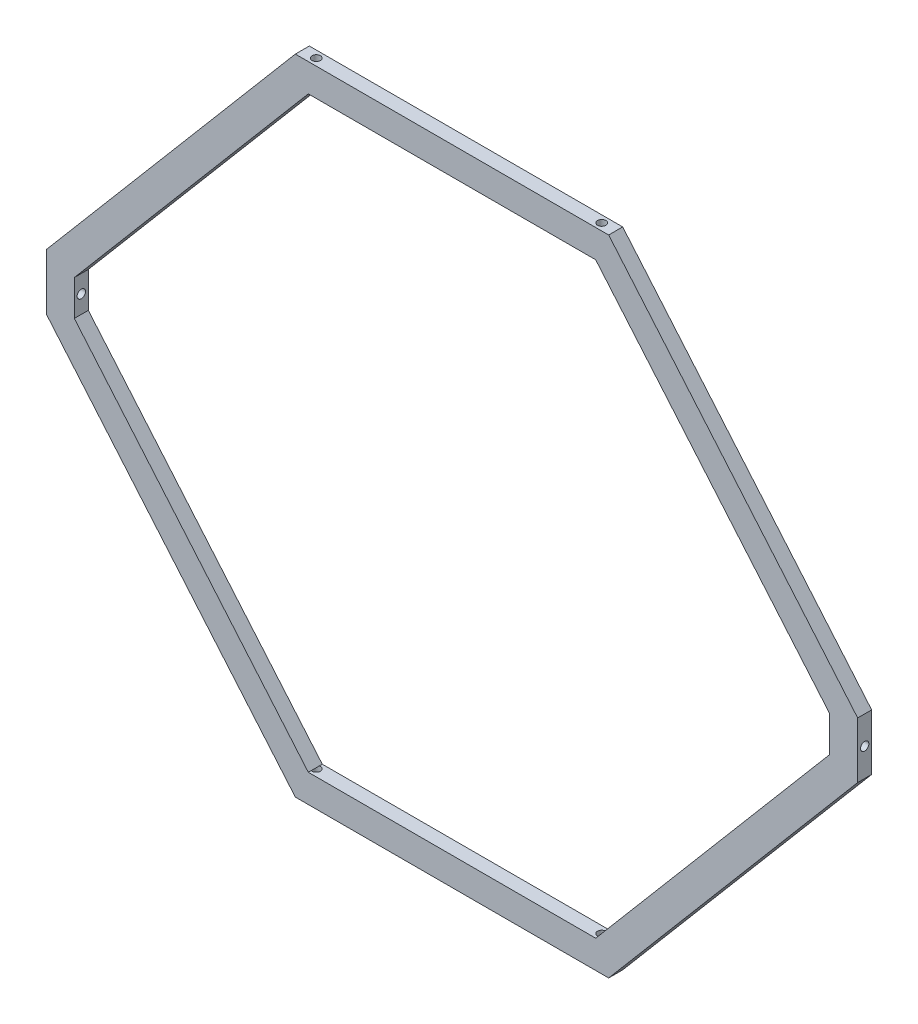
ISO-10303-21;
HEADER;
FILE_DESCRIPTION(('STEP AP214'),'2;1');
FILE_NAME('part.step','',(''),(''),'','','');
FILE_SCHEMA(('AUTOMOTIVE_DESIGN { 1 0 10303 214 1 1 1 1 }'));
ENDSEC;
DATA;
#1=APPLICATION_CONTEXT('core data for automotive mechanical design processes');
#2=APPLICATION_PROTOCOL_DEFINITION('international standard','automotive_design',2000,#1);
#3=PRODUCT_CONTEXT('',#1,'mechanical');
#4=PRODUCT('Part','Part','',(#3));
#5=PRODUCT_RELATED_PRODUCT_CATEGORY('part','',(#4));
#6=PRODUCT_DEFINITION_FORMATION('','',#4);
#7=PRODUCT_DEFINITION_CONTEXT('part definition',#1,'design');
#8=PRODUCT_DEFINITION('design','',#6,#7);
#9=PRODUCT_DEFINITION_SHAPE('','',#8);
#10=(LENGTH_UNIT() NAMED_UNIT(*) SI_UNIT(.MILLI.,.METRE.));
#11=(NAMED_UNIT(*) PLANE_ANGLE_UNIT() SI_UNIT($,.RADIAN.));
#12=(NAMED_UNIT(*) SI_UNIT($,.STERADIAN.) SOLID_ANGLE_UNIT());
#13=UNCERTAINTY_MEASURE_WITH_UNIT(LENGTH_MEASURE(1.E-05),#10,'distance_accuracy_value','');
#14=(GEOMETRIC_REPRESENTATION_CONTEXT(3) GLOBAL_UNCERTAINTY_ASSIGNED_CONTEXT((#13)) GLOBAL_UNIT_ASSIGNED_CONTEXT((#10,
#11,#12)) REPRESENTATION_CONTEXT('',''));
#15=CARTESIAN_POINT('',(0.,0.,0.));
#16=DIRECTION('',(0.,0.,1.));
#17=DIRECTION('',(1.,0.,0.));
#18=AXIS2_PLACEMENT_3D('',#15,#16,#17);
#19=CARTESIAN_POINT('',(0.,0.,5.));
#20=DIRECTION('',(0.,0.,-1.));
#21=DIRECTION('',(-1.,0.,0.));
#22=AXIS2_PLACEMENT_3D('',#19,#20,#21);
#23=PLANE('',#22);
#24=DIRECTION('',(-0.646593359584783,-0.762834862431486,0.));
#25=VECTOR('',#24,1.);
#26=CARTESIAN_POINT('',(-89.,-105.,5.));
#27=LINE('',#26,#25);
#28=CARTESIAN_POINT('',(0.,0.,5.));
#29=VERTEX_POINT('',#28);
#30=CARTESIAN_POINT('',(-89.,-105.,5.));
#31=VERTEX_POINT('',#30);
#32=EDGE_CURVE('E216',#29,#31,#27,.T.);
#33=ORIENTED_EDGE('',*,*,#32,.T.);
#34=DIRECTION('',(0.,-1.,0.));
#35=VECTOR('',#34,1.);
#36=CARTESIAN_POINT('',(-89.,-115.,5.));
#37=LINE('',#36,#35);
#38=CARTESIAN_POINT('',(-89.,-125.,5.));
#39=VERTEX_POINT('',#38);
#40=EDGE_CURVE('E219',#31,#39,#37,.T.);
#41=ORIENTED_EDGE('',*,*,#40,.T.);
#42=DIRECTION('',(0.646593359584783,-0.762834862431486,0.));
#43=VECTOR('',#42,1.);
#44=CARTESIAN_POINT('',(0.,-230.,5.));
#45=LINE('',#44,#43);
#46=CARTESIAN_POINT('',(0.,-230.,5.));
#47=VERTEX_POINT('',#46);
#48=EDGE_CURVE('E222',#39,#47,#45,.T.);
#49=ORIENTED_EDGE('',*,*,#48,.T.);
#50=DIRECTION('',(1.,0.,0.));
#51=VECTOR('',#50,1.);
#52=CARTESIAN_POINT('',(56.,-230.,5.));
#53=LINE('',#52,#51);
#54=CARTESIAN_POINT('',(112.,-230.,5.));
#55=VERTEX_POINT('',#54);
#56=EDGE_CURVE('E224',#47,#55,#53,.T.);
#57=ORIENTED_EDGE('',*,*,#56,.T.);
#58=DIRECTION('',(0.646593359584783,0.762834862431485,0.));
#59=VECTOR('',#58,1.);
#60=CARTESIAN_POINT('',(201.,-125.,5.));
#61=LINE('',#60,#59);
#62=CARTESIAN_POINT('',(201.,-125.,5.));
#63=VERTEX_POINT('',#62);
#64=EDGE_CURVE('E226',#55,#63,#61,.T.);
#65=ORIENTED_EDGE('',*,*,#64,.T.);
#66=DIRECTION('',(0.,1.,0.));
#67=VECTOR('',#66,1.);
#68=CARTESIAN_POINT('',(201.,-115.,5.));
#69=LINE('',#68,#67);
#70=CARTESIAN_POINT('',(201.,-105.,5.));
#71=VERTEX_POINT('',#70);
#72=EDGE_CURVE('E228',#63,#71,#69,.T.);
#73=ORIENTED_EDGE('',*,*,#72,.T.);
#74=DIRECTION('',(-0.646593359584783,0.762834862431486,0.));
#75=VECTOR('',#74,1.);
#76=CARTESIAN_POINT('',(112.,0.,5.));
#77=LINE('',#76,#75);
#78=CARTESIAN_POINT('',(112.,0.,5.));
#79=VERTEX_POINT('',#78);
#80=EDGE_CURVE('E230',#71,#79,#77,.T.);
#81=ORIENTED_EDGE('',*,*,#80,.T.);
#82=DIRECTION('',(-1.,0.,0.));
#83=VECTOR('',#82,1.);
#84=CARTESIAN_POINT('',(0.,0.,5.));
#85=LINE('',#84,#83);
#86=EDGE_CURVE('E232',#79,#29,#85,.T.);
#87=ORIENTED_EDGE('',*,*,#86,.T.);
#88=EDGE_LOOP('',(#33,#41,#49,#57,#65,#73,#81,#87));
#89=FACE_BOUND('',#88,.T.);
#90=DIRECTION('',(-0.646593359584783,-0.762834862431486,0.));
#91=VECTOR('',#90,1.);
#92=CARTESIAN_POINT('',(-79.,-108.667917927905,5.));
#93=LINE('',#92,#91);
#94=CARTESIAN_POINT('',(4.63280662460493,-10.,5.));
#95=VERTEX_POINT('',#94);
#96=CARTESIAN_POINT('',(-79.,-108.667917927905,5.));
#97=VERTEX_POINT('',#96);
#98=EDGE_CURVE('E335',#95,#97,#93,.T.);
#99=ORIENTED_EDGE('',*,*,#98,.F.);
#100=DIRECTION('',(-1.,0.,0.));
#101=VECTOR('',#100,1.);
#102=CARTESIAN_POINT('',(4.63280662460493,-10.,5.));
#103=LINE('',#102,#101);
#104=CARTESIAN_POINT('',(107.367193375395,-10.,5.));
#105=VERTEX_POINT('',#104);
#106=EDGE_CURVE('E303',#105,#95,#103,.T.);
#107=ORIENTED_EDGE('',*,*,#106,.F.);
#108=DIRECTION('',(-0.646593359584783,0.762834862431486,0.));
#109=VECTOR('',#108,1.);
#110=CARTESIAN_POINT('',(107.367193375395,-10.,5.));
#111=LINE('',#110,#109);
#112=CARTESIAN_POINT('',(191.,-108.667917927905,5.));
#113=VERTEX_POINT('',#112);
#114=EDGE_CURVE('E310',#113,#105,#111,.T.);
#115=ORIENTED_EDGE('',*,*,#114,.F.);
#116=DIRECTION('',(0.,1.,0.));
#117=VECTOR('',#116,1.);
#118=CARTESIAN_POINT('',(191.,-115.,5.));
#119=LINE('',#118,#117);
#120=CARTESIAN_POINT('',(191.,-121.332082072095,5.));
#121=VERTEX_POINT('',#120);
#122=EDGE_CURVE('E313',#121,#113,#119,.T.);
#123=ORIENTED_EDGE('',*,*,#122,.F.);
#124=DIRECTION('',(0.646593359584783,0.762834862431486,0.));
#125=VECTOR('',#124,1.);
#126=CARTESIAN_POINT('',(191.,-121.332082072095,5.));
#127=LINE('',#126,#125);
#128=CARTESIAN_POINT('',(107.367193375395,-220.,5.));
#129=VERTEX_POINT('',#128);
#130=EDGE_CURVE('E348',#129,#121,#127,.T.);
#131=ORIENTED_EDGE('',*,*,#130,.F.);
#132=DIRECTION('',(1.,0.,0.));
#133=VECTOR('',#132,1.);
#134=CARTESIAN_POINT('',(56.,-220.,5.));
#135=LINE('',#134,#133);
#136=CARTESIAN_POINT('',(4.63280662460491,-220.,5.));
#137=VERTEX_POINT('',#136);
#138=EDGE_CURVE('E346',#137,#129,#135,.T.);
#139=ORIENTED_EDGE('',*,*,#138,.F.);
#140=DIRECTION('',(0.646593359584783,-0.762834862431486,0.));
#141=VECTOR('',#140,1.);
#142=CARTESIAN_POINT('',(4.63280662460491,-220.,5.));
#143=LINE('',#142,#141);
#144=CARTESIAN_POINT('',(-79.,-121.332082072095,5.));
#145=VERTEX_POINT('',#144);
#146=EDGE_CURVE('E340',#145,#137,#143,.T.);
#147=ORIENTED_EDGE('',*,*,#146,.F.);
#148=DIRECTION('',(0.,-1.,0.));
#149=VECTOR('',#148,1.);
#150=CARTESIAN_POINT('',(-79.,-115.,5.));
#151=LINE('',#150,#149);
#152=EDGE_CURVE('E337',#97,#145,#151,.T.);
#153=ORIENTED_EDGE('',*,*,#152,.F.);
#154=EDGE_LOOP('',(#99,#107,#115,#123,#131,#139,#147,#153));
#155=FACE_BOUND('',#154,.T.);
#156=ADVANCED_FACE('F34',(#89,#155),#23,.F.);
#157=CARTESIAN_POINT('',(0.,0.,0.));
#158=DIRECTION('',(0.,0.,-1.));
#159=DIRECTION('',(-1.,0.,0.));
#160=AXIS2_PLACEMENT_3D('',#157,#158,#159);
#161=PLANE('',#160);
#162=DIRECTION('',(-0.646593359584783,-0.762834862431486,0.));
#163=VECTOR('',#162,1.);
#164=CARTESIAN_POINT('',(-89.,-105.,0.));
#165=LINE('',#164,#163);
#166=CARTESIAN_POINT('',(0.,0.,0.));
#167=VERTEX_POINT('',#166);
#168=CARTESIAN_POINT('',(-89.,-105.,0.));
#169=VERTEX_POINT('',#168);
#170=EDGE_CURVE('E213',#167,#169,#165,.T.);
#171=ORIENTED_EDGE('',*,*,#170,.F.);
#172=DIRECTION('',(-1.,0.,0.));
#173=VECTOR('',#172,1.);
#174=CARTESIAN_POINT('',(0.,0.,0.));
#175=LINE('',#174,#173);
#176=CARTESIAN_POINT('',(112.,0.,0.));
#177=VERTEX_POINT('',#176);
#178=EDGE_CURVE('E220',#177,#167,#175,.T.);
#179=ORIENTED_EDGE('',*,*,#178,.F.);
#180=DIRECTION('',(-0.646593359584783,0.762834862431486,0.));
#181=VECTOR('',#180,1.);
#182=CARTESIAN_POINT('',(112.,0.,0.));
#183=LINE('',#182,#181);
#184=CARTESIAN_POINT('',(201.,-105.,0.));
#185=VERTEX_POINT('',#184);
#186=EDGE_CURVE('E249',#185,#177,#183,.T.);
#187=ORIENTED_EDGE('',*,*,#186,.F.);
#188=DIRECTION('',(0.,1.,0.));
#189=VECTOR('',#188,1.);
#190=CARTESIAN_POINT('',(201.,-115.,0.));
#191=LINE('',#190,#189);
#192=CARTESIAN_POINT('',(201.,-125.,0.));
#193=VERTEX_POINT('',#192);
#194=EDGE_CURVE('E247',#193,#185,#191,.T.);
#195=ORIENTED_EDGE('',*,*,#194,.F.);
#196=DIRECTION('',(0.646593359584783,0.762834862431485,0.));
#197=VECTOR('',#196,1.);
#198=CARTESIAN_POINT('',(201.,-125.,0.));
#199=LINE('',#198,#197);
#200=CARTESIAN_POINT('',(112.,-230.,0.));
#201=VERTEX_POINT('',#200);
#202=EDGE_CURVE('E244',#201,#193,#199,.T.);
#203=ORIENTED_EDGE('',*,*,#202,.F.);
#204=DIRECTION('',(1.,0.,0.));
#205=VECTOR('',#204,1.);
#206=CARTESIAN_POINT('',(56.,-230.,0.));
#207=LINE('',#206,#205);
#208=CARTESIAN_POINT('',(0.,-230.,0.));
#209=VERTEX_POINT('',#208);
#210=EDGE_CURVE('E242',#209,#201,#207,.T.);
#211=ORIENTED_EDGE('',*,*,#210,.F.);
#212=DIRECTION('',(0.646593359584783,-0.762834862431486,0.));
#213=VECTOR('',#212,1.);
#214=CARTESIAN_POINT('',(0.,-230.,0.));
#215=LINE('',#214,#213);
#216=CARTESIAN_POINT('',(-89.,-125.,0.));
#217=VERTEX_POINT('',#216);
#218=EDGE_CURVE('E239',#217,#209,#215,.T.);
#219=ORIENTED_EDGE('',*,*,#218,.F.);
#220=DIRECTION('',(0.,-1.,0.));
#221=VECTOR('',#220,1.);
#222=CARTESIAN_POINT('',(-89.,-115.,0.));
#223=LINE('',#222,#221);
#224=EDGE_CURVE('E237',#169,#217,#223,.T.);
#225=ORIENTED_EDGE('',*,*,#224,.F.);
#226=EDGE_LOOP('',(#171,#179,#187,#195,#203,#211,#219,#225));
#227=FACE_BOUND('',#226,.T.);
#228=DIRECTION('',(-1.,0.,0.));
#229=VECTOR('',#228,1.);
#230=CARTESIAN_POINT('',(4.63280662460493,-10.,0.));
#231=LINE('',#230,#229);
#232=CARTESIAN_POINT('',(107.367193375395,-10.,0.));
#233=VERTEX_POINT('',#232);
#234=CARTESIAN_POINT('',(4.63280662460493,-10.,0.));
#235=VERTEX_POINT('',#234);
#236=EDGE_CURVE('E333',#233,#235,#231,.T.);
#237=ORIENTED_EDGE('',*,*,#236,.T.);
#238=DIRECTION('',(-0.646593359584783,-0.762834862431486,0.));
#239=VECTOR('',#238,1.);
#240=CARTESIAN_POINT('',(-79.,-108.667917927905,0.));
#241=LINE('',#240,#239);
#242=CARTESIAN_POINT('',(-79.,-108.667917927905,0.));
#243=VERTEX_POINT('',#242);
#244=EDGE_CURVE('E290',#235,#243,#241,.T.);
#245=ORIENTED_EDGE('',*,*,#244,.T.);
#246=DIRECTION('',(0.,-1.,0.));
#247=VECTOR('',#246,1.);
#248=CARTESIAN_POINT('',(-79.,-115.,0.));
#249=LINE('',#248,#247);
#250=CARTESIAN_POINT('',(-79.,-121.332082072095,0.));
#251=VERTEX_POINT('',#250);
#252=EDGE_CURVE('E319',#243,#251,#249,.T.);
#253=ORIENTED_EDGE('',*,*,#252,.T.);
#254=DIRECTION('',(0.646593359584783,-0.762834862431486,0.));
#255=VECTOR('',#254,1.);
#256=CARTESIAN_POINT('',(4.63280662460491,-220.,0.));
#257=LINE('',#256,#255);
#258=CARTESIAN_POINT('',(4.63280662460491,-220.,0.));
#259=VERTEX_POINT('',#258);
#260=EDGE_CURVE('E322',#251,#259,#257,.T.);
#261=ORIENTED_EDGE('',*,*,#260,.T.);
#262=DIRECTION('',(1.,0.,0.));
#263=VECTOR('',#262,1.);
#264=CARTESIAN_POINT('',(56.,-220.,0.));
#265=LINE('',#264,#263);
#266=CARTESIAN_POINT('',(107.367193375395,-220.,0.));
#267=VERTEX_POINT('',#266);
#268=EDGE_CURVE('E325',#259,#267,#265,.T.);
#269=ORIENTED_EDGE('',*,*,#268,.T.);
#270=DIRECTION('',(0.646593359584783,0.762834862431486,0.));
#271=VECTOR('',#270,1.);
#272=CARTESIAN_POINT('',(191.,-121.332082072095,0.));
#273=LINE('',#272,#271);
#274=CARTESIAN_POINT('',(191.,-121.332082072095,0.));
#275=VERTEX_POINT('',#274);
#276=EDGE_CURVE('E192',#267,#275,#273,.T.);
#277=ORIENTED_EDGE('',*,*,#276,.T.);
#278=DIRECTION('',(0.,1.,0.));
#279=VECTOR('',#278,1.);
#280=CARTESIAN_POINT('',(191.,-115.,0.));
#281=LINE('',#280,#279);
#282=CARTESIAN_POINT('',(191.,-108.667917927905,0.));
#283=VERTEX_POINT('',#282);
#284=EDGE_CURVE('E328',#275,#283,#281,.T.);
#285=ORIENTED_EDGE('',*,*,#284,.T.);
#286=DIRECTION('',(-0.646593359584783,0.762834862431486,0.));
#287=VECTOR('',#286,1.);
#288=CARTESIAN_POINT('',(107.367193375395,-10.,0.));
#289=LINE('',#288,#287);
#290=EDGE_CURVE('E331',#283,#233,#289,.T.);
#291=ORIENTED_EDGE('',*,*,#290,.T.);
#292=EDGE_LOOP('',(#237,#245,#253,#261,#269,#277,#285,#291));
#293=FACE_BOUND('',#292,.T.);
#294=ADVANCED_FACE('F367',(#227,#293),#161,.T.);
#295=CARTESIAN_POINT('',(-89.,-105.,5.));
#296=DIRECTION('',(0.762834862431486,-0.646593359584783,0.));
#297=DIRECTION('',(0.646593359584783,0.762834862431486,0.));
#298=AXIS2_PLACEMENT_3D('',#295,#296,#297);
#299=PLANE('',#298);
#300=ORIENTED_EDGE('',*,*,#170,.T.);
#301=DIRECTION('',(0.,0.,-1.));
#302=VECTOR('',#301,1.);
#303=CARTESIAN_POINT('',(-89.,-105.,5.));
#304=LINE('',#303,#302);
#305=EDGE_CURVE('E272',#31,#169,#304,.T.);
#306=ORIENTED_EDGE('',*,*,#305,.F.);
#307=ORIENTED_EDGE('',*,*,#32,.F.);
#308=DIRECTION('',(0.,0.,-1.));
#309=VECTOR('',#308,1.);
#310=CARTESIAN_POINT('',(0.,0.,5.));
#311=LINE('',#310,#309);
#312=EDGE_CURVE('E234',#29,#167,#311,.T.);
#313=ORIENTED_EDGE('',*,*,#312,.T.);
#314=EDGE_LOOP('',(#300,#306,#307,#313));
#315=FACE_BOUND('',#314,.T.);
#316=ADVANCED_FACE('F36',(#315),#299,.F.);
#317=CARTESIAN_POINT('',(-89.,-115.,5.));
#318=DIRECTION('',(1.,0.,0.));
#319=DIRECTION('',(0.,0.,-1.));
#320=AXIS2_PLACEMENT_3D('',#317,#318,#319);
#321=PLANE('',#320);
#322=CARTESIAN_POINT('',(-89.,-115.,2.5));
#323=DIRECTION('',(-1.,0.,0.));
#324=DIRECTION('',(0.,0.,1.));
#325=AXIS2_PLACEMENT_3D('',#322,#323,#324);
#326=CIRCLE('',#325,1.5);
#327=CARTESIAN_POINT('',(-89.,-115.,4.));
#328=VERTEX_POINT('',#327);
#329=EDGE_CURVE('E412',#328,#328,#326,.T.);
#330=ORIENTED_EDGE('',*,*,#329,.F.);
#331=EDGE_LOOP('',(#330));
#332=FACE_BOUND('',#331,.T.);
#333=ORIENTED_EDGE('',*,*,#224,.T.);
#334=DIRECTION('',(0.,0.,-1.));
#335=VECTOR('',#334,1.);
#336=CARTESIAN_POINT('',(-89.,-125.,5.));
#337=LINE('',#336,#335);
#338=EDGE_CURVE('E269',#39,#217,#337,.T.);
#339=ORIENTED_EDGE('',*,*,#338,.F.);
#340=ORIENTED_EDGE('',*,*,#40,.F.);
#341=ORIENTED_EDGE('',*,*,#305,.T.);
#342=EDGE_LOOP('',(#333,#339,#340,#341));
#343=FACE_BOUND('',#342,.T.);
#344=ADVANCED_FACE('F375',(#332,#343),#321,.F.);
#345=CARTESIAN_POINT('',(0.,-230.,5.));
#346=DIRECTION('',(0.762834862431486,0.646593359584783,0.));
#347=DIRECTION('',(-0.646593359584783,0.762834862431486,0.));
#348=AXIS2_PLACEMENT_3D('',#345,#346,#347);
#349=PLANE('',#348);
#350=ORIENTED_EDGE('',*,*,#218,.T.);
#351=DIRECTION('',(0.,0.,-1.));
#352=VECTOR('',#351,1.);
#353=CARTESIAN_POINT('',(0.,-230.,5.));
#354=LINE('',#353,#352);
#355=EDGE_CURVE('E266',#47,#209,#354,.T.);
#356=ORIENTED_EDGE('',*,*,#355,.F.);
#357=ORIENTED_EDGE('',*,*,#48,.F.);
#358=ORIENTED_EDGE('',*,*,#338,.T.);
#359=EDGE_LOOP('',(#350,#356,#357,#358));
#360=FACE_BOUND('',#359,.T.);
#361=ADVANCED_FACE('F401',(#360),#349,.F.);
#362=CARTESIAN_POINT('',(56.,-230.,5.));
#363=DIRECTION('',(0.,1.,0.));
#364=DIRECTION('',(0.,0.,1.));
#365=AXIS2_PLACEMENT_3D('',#362,#363,#364);
#366=PLANE('',#365);
#367=CARTESIAN_POINT('',(107.,-230.,2.5));
#368=DIRECTION('',(0.,-1.,0.));
#369=DIRECTION('',(0.,0.,1.));
#370=AXIS2_PLACEMENT_3D('',#367,#368,#369);
#371=CIRCLE('',#370,1.50000000000001);
#372=CARTESIAN_POINT('',(107.,-230.,4.00000000000001));
#373=VERTEX_POINT('',#372);
#374=EDGE_CURVE('E188',#373,#373,#371,.T.);
#375=ORIENTED_EDGE('',*,*,#374,.F.);
#376=EDGE_LOOP('',(#375));
#377=FACE_BOUND('',#376,.T.);
#378=CARTESIAN_POINT('',(5.,-230.,2.5));
#379=DIRECTION('',(0.,-1.,0.));
#380=DIRECTION('',(0.,0.,-1.));
#381=AXIS2_PLACEMENT_3D('',#378,#379,#380);
#382=CIRCLE('',#381,1.5);
#383=CARTESIAN_POINT('',(5.,-230.,1.));
#384=VERTEX_POINT('',#383);
#385=EDGE_CURVE('E440',#384,#384,#382,.T.);
#386=ORIENTED_EDGE('',*,*,#385,.F.);
#387=EDGE_LOOP('',(#386));
#388=FACE_BOUND('',#387,.T.);
#389=ORIENTED_EDGE('',*,*,#210,.T.);
#390=DIRECTION('',(0.,0.,-1.));
#391=VECTOR('',#390,1.);
#392=CARTESIAN_POINT('',(112.,-230.,5.));
#393=LINE('',#392,#391);
#394=EDGE_CURVE('E263',#55,#201,#393,.T.);
#395=ORIENTED_EDGE('',*,*,#394,.F.);
#396=ORIENTED_EDGE('',*,*,#56,.F.);
#397=ORIENTED_EDGE('',*,*,#355,.T.);
#398=EDGE_LOOP('',(#389,#395,#396,#397));
#399=FACE_BOUND('',#398,.T.);
#400=ADVANCED_FACE('F397',(#377,#388,#399),#366,.F.);
#401=CARTESIAN_POINT('',(201.,-125.,5.));
#402=DIRECTION('',(-0.762834862431485,0.646593359584783,0.));
#403=DIRECTION('',(-0.646593359584783,-0.762834862431485,0.));
#404=AXIS2_PLACEMENT_3D('',#401,#402,#403);
#405=PLANE('',#404);
#406=ORIENTED_EDGE('',*,*,#202,.T.);
#407=DIRECTION('',(0.,0.,-1.));
#408=VECTOR('',#407,1.);
#409=CARTESIAN_POINT('',(201.,-125.,5.));
#410=LINE('',#409,#408);
#411=EDGE_CURVE('E260',#63,#193,#410,.T.);
#412=ORIENTED_EDGE('',*,*,#411,.F.);
#413=ORIENTED_EDGE('',*,*,#64,.F.);
#414=ORIENTED_EDGE('',*,*,#394,.T.);
#415=EDGE_LOOP('',(#406,#412,#413,#414));
#416=FACE_BOUND('',#415,.T.);
#417=ADVANCED_FACE('F393',(#416),#405,.F.);
#418=CARTESIAN_POINT('',(201.,-115.,5.));
#419=DIRECTION('',(-1.,0.,0.));
#420=DIRECTION('',(0.,0.,1.));
#421=AXIS2_PLACEMENT_3D('',#418,#419,#420);
#422=PLANE('',#421);
#423=CARTESIAN_POINT('',(201.,-115.,2.5));
#424=DIRECTION('',(1.,0.,0.));
#425=DIRECTION('',(0.,0.,-1.));
#426=AXIS2_PLACEMENT_3D('',#423,#424,#425);
#427=CIRCLE('',#426,1.5);
#428=CARTESIAN_POINT('',(201.,-115.,0.999999999999999));
#429=VERTEX_POINT('',#428);
#430=EDGE_CURVE('E443',#429,#429,#427,.T.);
#431=ORIENTED_EDGE('',*,*,#430,.F.);
#432=EDGE_LOOP('',(#431));
#433=FACE_BOUND('',#432,.T.);
#434=ORIENTED_EDGE('',*,*,#194,.T.);
#435=DIRECTION('',(0.,0.,-1.));
#436=VECTOR('',#435,1.);
#437=CARTESIAN_POINT('',(201.,-105.,5.));
#438=LINE('',#437,#436);
#439=EDGE_CURVE('E257',#71,#185,#438,.T.);
#440=ORIENTED_EDGE('',*,*,#439,.F.);
#441=ORIENTED_EDGE('',*,*,#72,.F.);
#442=ORIENTED_EDGE('',*,*,#411,.T.);
#443=EDGE_LOOP('',(#434,#440,#441,#442));
#444=FACE_BOUND('',#443,.T.);
#445=ADVANCED_FACE('F389',(#433,#444),#422,.F.);
#446=CARTESIAN_POINT('',(112.,0.,5.));
#447=DIRECTION('',(-0.762834862431486,-0.646593359584783,0.));
#448=DIRECTION('',(0.646593359584783,-0.762834862431486,0.));
#449=AXIS2_PLACEMENT_3D('',#446,#447,#448);
#450=PLANE('',#449);
#451=ORIENTED_EDGE('',*,*,#186,.T.);
#452=DIRECTION('',(0.,0.,-1.));
#453=VECTOR('',#452,1.);
#454=CARTESIAN_POINT('',(112.,0.,5.));
#455=LINE('',#454,#453);
#456=EDGE_CURVE('E254',#79,#177,#455,.T.);
#457=ORIENTED_EDGE('',*,*,#456,.F.);
#458=ORIENTED_EDGE('',*,*,#80,.F.);
#459=ORIENTED_EDGE('',*,*,#439,.T.);
#460=EDGE_LOOP('',(#451,#457,#458,#459));
#461=FACE_BOUND('',#460,.T.);
#462=ADVANCED_FACE('F385',(#461),#450,.F.);
#463=CARTESIAN_POINT('',(0.,0.,5.));
#464=DIRECTION('',(0.,-1.,0.));
#465=DIRECTION('',(0.,0.,-1.));
#466=AXIS2_PLACEMENT_3D('',#463,#464,#465);
#467=PLANE('',#466);
#468=CARTESIAN_POINT('',(5.,0.,2.5));
#469=DIRECTION('',(0.,1.,0.));
#470=DIRECTION('',(0.,0.,1.));
#471=AXIS2_PLACEMENT_3D('',#468,#469,#470);
#472=CIRCLE('',#471,1.5);
#473=CARTESIAN_POINT('',(5.,0.,4.));
#474=VERTEX_POINT('',#473);
#475=EDGE_CURVE('E291',#474,#474,#472,.T.);
#476=ORIENTED_EDGE('',*,*,#475,.F.);
#477=EDGE_LOOP('',(#476));
#478=FACE_BOUND('',#477,.T.);
#479=CARTESIAN_POINT('',(107.,0.,2.5));
#480=DIRECTION('',(0.,1.,0.));
#481=DIRECTION('',(0.,0.,1.));
#482=AXIS2_PLACEMENT_3D('',#479,#480,#481);
#483=CIRCLE('',#482,1.5);
#484=CARTESIAN_POINT('',(107.,0.,4.));
#485=VERTEX_POINT('',#484);
#486=EDGE_CURVE('E182',#485,#485,#483,.T.);
#487=ORIENTED_EDGE('',*,*,#486,.F.);
#488=EDGE_LOOP('',(#487));
#489=FACE_BOUND('',#488,.T.);
#490=ORIENTED_EDGE('',*,*,#178,.T.);
#491=ORIENTED_EDGE('',*,*,#312,.F.);
#492=ORIENTED_EDGE('',*,*,#86,.F.);
#493=ORIENTED_EDGE('',*,*,#456,.T.);
#494=EDGE_LOOP('',(#490,#491,#492,#493));
#495=FACE_BOUND('',#494,.T.);
#496=ADVANCED_FACE('F382',(#478,#489,#495),#467,.F.);
#497=CARTESIAN_POINT('',(-79.,-108.667917927905,5.));
#498=DIRECTION('',(0.762834862431486,-0.646593359584783,0.));
#499=DIRECTION('',(0.646593359584783,0.762834862431486,0.));
#500=AXIS2_PLACEMENT_3D('',#497,#498,#499);
#501=PLANE('',#500);
#502=ORIENTED_EDGE('',*,*,#244,.F.);
#503=DIRECTION('',(0.,0.,-1.));
#504=VECTOR('',#503,1.);
#505=CARTESIAN_POINT('',(4.63280662460493,-10.,5.));
#506=LINE('',#505,#504);
#507=CARTESIAN_POINT('',(4.63280662460493,-10.,1.04563793192136));
#508=VERTEX_POINT('',#507);
#509=EDGE_CURVE('E299',#508,#235,#506,.T.);
#510=ORIENTED_EDGE('',*,*,#509,.F.);
#511=CARTESIAN_POINT('',(4.63280662460493,-10.,3.95436206807864));
#512=VERTEX_POINT('',#511);
#513=EDGE_CURVE('E289',#512,#508,#506,.T.);
#514=ORIENTED_EDGE('',*,*,#513,.F.);
#515=EDGE_CURVE('E297',#95,#512,#506,.T.);
#516=ORIENTED_EDGE('',*,*,#515,.F.);
#517=ORIENTED_EDGE('',*,*,#98,.T.);
#518=DIRECTION('',(0.,0.,-1.));
#519=VECTOR('',#518,1.);
#520=CARTESIAN_POINT('',(-79.,-108.667917927905,5.));
#521=LINE('',#520,#519);
#522=EDGE_CURVE('E209',#97,#243,#521,.T.);
#523=ORIENTED_EDGE('',*,*,#522,.T.);
#524=EDGE_LOOP('',(#502,#510,#514,#516,#517,#523));
#525=FACE_BOUND('',#524,.T.);
#526=ADVANCED_FACE('F296',(#525),#501,.T.);
#527=CARTESIAN_POINT('',(-79.,-115.,5.));
#528=DIRECTION('',(1.,0.,0.));
#529=DIRECTION('',(0.,0.,-1.));
#530=AXIS2_PLACEMENT_3D('',#527,#528,#529);
#531=PLANE('',#530);
#532=CARTESIAN_POINT('',(-79.,-115.,2.5));
#533=DIRECTION('',(-1.,0.,0.));
#534=DIRECTION('',(0.,0.,1.));
#535=AXIS2_PLACEMENT_3D('',#532,#533,#534);
#536=CIRCLE('',#535,1.5);
#537=CARTESIAN_POINT('',(-79.,-115.,4.));
#538=VERTEX_POINT('',#537);
#539=EDGE_CURVE('E436',#538,#538,#536,.T.);
#540=ORIENTED_EDGE('',*,*,#539,.T.);
#541=EDGE_LOOP('',(#540));
#542=FACE_BOUND('',#541,.T.);
#543=ORIENTED_EDGE('',*,*,#252,.F.);
#544=ORIENTED_EDGE('',*,*,#522,.F.);
#545=ORIENTED_EDGE('',*,*,#152,.T.);
#546=DIRECTION('',(0.,0.,-1.));
#547=VECTOR('',#546,1.);
#548=CARTESIAN_POINT('',(-79.,-121.332082072095,5.));
#549=LINE('',#548,#547);
#550=EDGE_CURVE('E207',#145,#251,#549,.T.);
#551=ORIENTED_EDGE('',*,*,#550,.T.);
#552=EDGE_LOOP('',(#543,#544,#545,#551));
#553=FACE_BOUND('',#552,.T.);
#554=ADVANCED_FACE('F365',(#542,#553),#531,.T.);
#555=CARTESIAN_POINT('',(4.63280662460491,-220.,5.));
#556=DIRECTION('',(0.762834862431486,0.646593359584783,0.));
#557=DIRECTION('',(-0.646593359584783,0.762834862431486,0.));
#558=AXIS2_PLACEMENT_3D('',#555,#556,#557);
#559=PLANE('',#558);
#560=ORIENTED_EDGE('',*,*,#260,.F.);
#561=ORIENTED_EDGE('',*,*,#550,.F.);
#562=ORIENTED_EDGE('',*,*,#146,.T.);
#563=DIRECTION('',(0.,0.,-1.));
#564=VECTOR('',#563,1.);
#565=CARTESIAN_POINT('',(4.63280662460491,-220.,5.));
#566=LINE('',#565,#564);
#567=CARTESIAN_POINT('',(4.63280662460491,-220.,3.95436206807863));
#568=VERTEX_POINT('',#567);
#569=EDGE_CURVE('E200',#137,#568,#566,.T.);
#570=ORIENTED_EDGE('',*,*,#569,.T.);
#571=CARTESIAN_POINT('',(4.63280662460491,-220.,1.04563793192137));
#572=VERTEX_POINT('',#571);
#573=EDGE_CURVE('E199',#568,#572,#566,.T.);
#574=ORIENTED_EDGE('',*,*,#573,.T.);
#575=EDGE_CURVE('E198',#572,#259,#566,.T.);
#576=ORIENTED_EDGE('',*,*,#575,.T.);
#577=EDGE_LOOP('',(#560,#561,#562,#570,#574,#576));
#578=FACE_BOUND('',#577,.T.);
#579=ADVANCED_FACE('F366',(#578),#559,.T.);
#580=CARTESIAN_POINT('',(56.,-220.,5.));
#581=DIRECTION('',(0.,1.,0.));
#582=DIRECTION('',(0.,0.,1.));
#583=AXIS2_PLACEMENT_3D('',#580,#581,#582);
#584=PLANE('',#583);
#585=CARTESIAN_POINT('',(107.,-220.,2.5));
#586=DIRECTION('',(0.,-1.,0.));
#587=DIRECTION('',(0.,0.,1.));
#588=AXIS2_PLACEMENT_3D('',#585,#586,#587);
#589=CIRCLE('',#588,1.50000000000001);
#590=CARTESIAN_POINT('',(107.367193375395,-220.,3.95436206807865));
#591=VERTEX_POINT('',#590);
#592=CARTESIAN_POINT('',(107.367193375395,-220.,1.04563793192135));
#593=VERTEX_POINT('',#592);
#594=EDGE_CURVE('E181',#591,#593,#589,.T.);
#595=ORIENTED_EDGE('',*,*,#594,.T.);
#596=DIRECTION('',(0.,0.,-1.));
#597=VECTOR('',#596,1.);
#598=CARTESIAN_POINT('',(107.367193375395,-220.,5.));
#599=LINE('',#598,#597);
#600=EDGE_CURVE('E175',#593,#267,#599,.T.);
#601=ORIENTED_EDGE('',*,*,#600,.T.);
#602=ORIENTED_EDGE('',*,*,#268,.F.);
#603=ORIENTED_EDGE('',*,*,#575,.F.);
#604=CARTESIAN_POINT('',(5.,-220.,2.5));
#605=DIRECTION('',(0.,1.,0.));
#606=DIRECTION('',(0.,0.,1.));
#607=AXIS2_PLACEMENT_3D('',#604,#605,#606);
#608=CIRCLE('',#607,1.5);
#609=EDGE_CURVE('E11',#568,#572,#608,.T.);
#610=ORIENTED_EDGE('',*,*,#609,.F.);
#611=ORIENTED_EDGE('',*,*,#569,.F.);
#612=ORIENTED_EDGE('',*,*,#138,.T.);
#613=EDGE_CURVE('E174',#129,#591,#599,.T.);
#614=ORIENTED_EDGE('',*,*,#613,.T.);
#615=EDGE_LOOP('',(#595,#601,#602,#603,#610,#611,#612,#614));
#616=FACE_BOUND('',#615,.T.);
#617=ADVANCED_FACE('F185',(#616),#584,.T.);
#618=CARTESIAN_POINT('',(191.,-121.332082072095,5.));
#619=DIRECTION('',(-0.762834862431485,0.646593359584783,0.));
#620=DIRECTION('',(-0.646593359584783,-0.762834862431485,0.));
#621=AXIS2_PLACEMENT_3D('',#618,#619,#620);
#622=PLANE('',#621);
#623=ORIENTED_EDGE('',*,*,#276,.F.);
#624=ORIENTED_EDGE('',*,*,#600,.F.);
#625=EDGE_CURVE('E168',#591,#593,#599,.T.);
#626=ORIENTED_EDGE('',*,*,#625,.F.);
#627=ORIENTED_EDGE('',*,*,#613,.F.);
#628=ORIENTED_EDGE('',*,*,#130,.T.);
#629=DIRECTION('',(0.,0.,-1.));
#630=VECTOR('',#629,1.);
#631=CARTESIAN_POINT('',(191.,-121.332082072095,5.));
#632=LINE('',#631,#630);
#633=EDGE_CURVE('E194',#121,#275,#632,.T.);
#634=ORIENTED_EDGE('',*,*,#633,.T.);
#635=EDGE_LOOP('',(#623,#624,#626,#627,#628,#634));
#636=FACE_BOUND('',#635,.T.);
#637=ADVANCED_FACE('F189',(#636),#622,.T.);
#638=CARTESIAN_POINT('',(191.,-115.,5.));
#639=DIRECTION('',(-1.,0.,0.));
#640=DIRECTION('',(0.,0.,1.));
#641=AXIS2_PLACEMENT_3D('',#638,#639,#640);
#642=PLANE('',#641);
#643=CARTESIAN_POINT('',(191.,-115.,2.5));
#644=DIRECTION('',(1.,0.,0.));
#645=DIRECTION('',(0.,0.,-1.));
#646=AXIS2_PLACEMENT_3D('',#643,#644,#645);
#647=CIRCLE('',#646,1.5);
#648=CARTESIAN_POINT('',(191.,-115.,0.999999999999999));
#649=VERTEX_POINT('',#648);
#650=EDGE_CURVE('E437',#649,#649,#647,.T.);
#651=ORIENTED_EDGE('',*,*,#650,.T.);
#652=EDGE_LOOP('',(#651));
#653=FACE_BOUND('',#652,.T.);
#654=ORIENTED_EDGE('',*,*,#284,.F.);
#655=ORIENTED_EDGE('',*,*,#633,.F.);
#656=ORIENTED_EDGE('',*,*,#122,.T.);
#657=DIRECTION('',(0.,0.,-1.));
#658=VECTOR('',#657,1.);
#659=CARTESIAN_POINT('',(191.,-108.667917927905,5.));
#660=LINE('',#659,#658);
#661=EDGE_CURVE('E195',#113,#283,#660,.T.);
#662=ORIENTED_EDGE('',*,*,#661,.T.);
#663=EDGE_LOOP('',(#654,#655,#656,#662));
#664=FACE_BOUND('',#663,.T.);
#665=ADVANCED_FACE('F353',(#653,#664),#642,.T.);
#666=CARTESIAN_POINT('',(107.367193375395,-10.,5.));
#667=DIRECTION('',(-0.762834862431486,-0.646593359584783,0.));
#668=DIRECTION('',(0.646593359584783,-0.762834862431486,0.));
#669=AXIS2_PLACEMENT_3D('',#666,#667,#668);
#670=PLANE('',#669);
#671=ORIENTED_EDGE('',*,*,#290,.F.);
#672=ORIENTED_EDGE('',*,*,#661,.F.);
#673=ORIENTED_EDGE('',*,*,#114,.T.);
#674=DIRECTION('',(0.,0.,-1.));
#675=VECTOR('',#674,1.);
#676=CARTESIAN_POINT('',(107.367193375395,-10.,5.));
#677=LINE('',#676,#675);
#678=CARTESIAN_POINT('',(107.367193375395,-10.,3.95436206807863));
#679=VERTEX_POINT('',#678);
#680=EDGE_CURVE('E307',#105,#679,#677,.T.);
#681=ORIENTED_EDGE('',*,*,#680,.T.);
#682=CARTESIAN_POINT('',(107.367193375395,-10.,1.04563793192137));
#683=VERTEX_POINT('',#682);
#684=EDGE_CURVE('E305',#679,#683,#677,.T.);
#685=ORIENTED_EDGE('',*,*,#684,.T.);
#686=EDGE_CURVE('E304',#683,#233,#677,.T.);
#687=ORIENTED_EDGE('',*,*,#686,.T.);
#688=EDGE_LOOP('',(#671,#672,#673,#681,#685,#687));
#689=FACE_BOUND('',#688,.T.);
#690=ADVANCED_FACE('F359',(#689),#670,.T.);
#691=CARTESIAN_POINT('',(4.63280662460493,-10.,5.));
#692=DIRECTION('',(0.,-1.,0.));
#693=DIRECTION('',(0.,0.,-1.));
#694=AXIS2_PLACEMENT_3D('',#691,#692,#693);
#695=PLANE('',#694);
#696=CARTESIAN_POINT('',(5.,-10.,2.5));
#697=DIRECTION('',(0.,-1.,0.));
#698=DIRECTION('',(0.,0.,-1.));
#699=AXIS2_PLACEMENT_3D('',#696,#697,#698);
#700=CIRCLE('',#699,1.5);
#701=EDGE_CURVE('E42',#508,#512,#700,.T.);
#702=ORIENTED_EDGE('',*,*,#701,.F.);
#703=ORIENTED_EDGE('',*,*,#509,.T.);
#704=ORIENTED_EDGE('',*,*,#236,.F.);
#705=ORIENTED_EDGE('',*,*,#686,.F.);
#706=CARTESIAN_POINT('',(107.,-10.,2.5));
#707=DIRECTION('',(0.,-1.,0.));
#708=DIRECTION('',(0.,0.,-1.));
#709=AXIS2_PLACEMENT_3D('',#706,#707,#708);
#710=CIRCLE('',#709,1.5);
#711=EDGE_CURVE('E275',#679,#683,#710,.T.);
#712=ORIENTED_EDGE('',*,*,#711,.F.);
#713=ORIENTED_EDGE('',*,*,#680,.F.);
#714=ORIENTED_EDGE('',*,*,#106,.T.);
#715=ORIENTED_EDGE('',*,*,#515,.T.);
#716=EDGE_LOOP('',(#702,#703,#704,#705,#712,#713,#714,#715));
#717=FACE_BOUND('',#716,.T.);
#718=ADVANCED_FACE('F301',(#717),#695,.T.);
#719=CARTESIAN_POINT('',(107.,-10.,2.5));
#720=DIRECTION('',(0.,1.,0.));
#721=DIRECTION('',(0.,0.,1.));
#722=AXIS2_PLACEMENT_3D('',#719,#720,#721);
#723=CYLINDRICAL_SURFACE('',#722,1.5);
#724=CARTESIAN_POINT('',(107.,-10.,2.5));
#725=DIRECTION('',(0.,1.,0.));
#726=DIRECTION('',(0.,0.,1.));
#727=AXIS2_PLACEMENT_3D('',#724,#725,#726);
#728=CIRCLE('',#727,1.5);
#729=EDGE_CURVE('E453',#679,#683,#728,.T.);
#730=ORIENTED_EDGE('',*,*,#729,.F.);
#731=ORIENTED_EDGE('',*,*,#711,.T.);
#732=EDGE_LOOP('',(#730,#731));
#733=FACE_BOUND('',#732,.T.);
#734=ORIENTED_EDGE('',*,*,#486,.T.);
#735=EDGE_LOOP('',(#734));
#736=FACE_BOUND('',#735,.T.);
#737=ADVANCED_FACE('F461',(#733,#736),#723,.F.);
#738=CARTESIAN_POINT('',(107.,-10.,2.5));
#739=DIRECTION('',(0.,1.,0.));
#740=DIRECTION('',(0.,0.,1.));
#741=AXIS2_PLACEMENT_3D('',#738,#739,#740);
#742=PLANE('',#741);
#743=ORIENTED_EDGE('',*,*,#729,.T.);
#744=ORIENTED_EDGE('',*,*,#684,.F.);
#745=EDGE_LOOP('',(#743,#744));
#746=FACE_BOUND('',#745,.T.);
#747=ADVANCED_FACE('F464',(#746),#742,.T.);
#748=CARTESIAN_POINT('',(5.,-10.,2.5));
#749=DIRECTION('',(0.,1.,0.));
#750=DIRECTION('',(0.,0.,1.));
#751=AXIS2_PLACEMENT_3D('',#748,#749,#750);
#752=CYLINDRICAL_SURFACE('',#751,1.5);
#753=CARTESIAN_POINT('',(5.,-10.,2.5));
#754=DIRECTION('',(0.,1.,0.));
#755=DIRECTION('',(0.,0.,1.));
#756=AXIS2_PLACEMENT_3D('',#753,#754,#755);
#757=CIRCLE('',#756,1.5);
#758=EDGE_CURVE('E281',#508,#512,#757,.T.);
#759=ORIENTED_EDGE('',*,*,#758,.F.);
#760=ORIENTED_EDGE('',*,*,#701,.T.);
#761=EDGE_LOOP('',(#759,#760));
#762=FACE_BOUND('',#761,.T.);
#763=ORIENTED_EDGE('',*,*,#475,.T.);
#764=EDGE_LOOP('',(#763));
#765=FACE_BOUND('',#764,.T.);
#766=ADVANCED_FACE('F279',(#762,#765),#752,.F.);
#767=CARTESIAN_POINT('',(5.,-10.,2.5));
#768=DIRECTION('',(0.,1.,0.));
#769=DIRECTION('',(0.,0.,1.));
#770=AXIS2_PLACEMENT_3D('',#767,#768,#769);
#771=PLANE('',#770);
#772=ORIENTED_EDGE('',*,*,#758,.T.);
#773=ORIENTED_EDGE('',*,*,#513,.T.);
#774=EDGE_LOOP('',(#772,#773));
#775=FACE_BOUND('',#774,.T.);
#776=ADVANCED_FACE('F288',(#775),#771,.T.);
#777=CARTESIAN_POINT('',(107.,-220.,2.5));
#778=DIRECTION('',(0.,-1.,0.));
#779=DIRECTION('',(0.,0.,-1.));
#780=AXIS2_PLACEMENT_3D('',#777,#778,#779);
#781=CYLINDRICAL_SURFACE('',#780,1.50000000000001);
#782=EDGE_CURVE('E54',#593,#591,#589,.T.);
#783=ORIENTED_EDGE('',*,*,#782,.F.);
#784=ORIENTED_EDGE('',*,*,#594,.F.);
#785=EDGE_LOOP('',(#783,#784));
#786=FACE_BOUND('',#785,.T.);
#787=ORIENTED_EDGE('',*,*,#374,.T.);
#788=EDGE_LOOP('',(#787));
#789=FACE_BOUND('',#788,.T.);
#790=ADVANCED_FACE('F179',(#786,#789),#781,.F.);
#791=CARTESIAN_POINT('',(107.,-220.,2.5));
#792=DIRECTION('',(0.,1.,0.));
#793=DIRECTION('',(0.,0.,1.));
#794=AXIS2_PLACEMENT_3D('',#791,#792,#793);
#795=PLANE('',#794);
#796=ORIENTED_EDGE('',*,*,#625,.T.);
#797=ORIENTED_EDGE('',*,*,#782,.T.);
#798=EDGE_LOOP('',(#796,#797));
#799=FACE_BOUND('',#798,.T.);
#800=ADVANCED_FACE('F169',(#799),#795,.F.);
#801=CARTESIAN_POINT('',(5.,-220.,2.5));
#802=DIRECTION('',(0.,-1.,0.));
#803=DIRECTION('',(0.,0.,-1.));
#804=AXIS2_PLACEMENT_3D('',#801,#802,#803);
#805=CYLINDRICAL_SURFACE('',#804,1.5);
#806=CARTESIAN_POINT('',(5.,-220.,2.5));
#807=DIRECTION('',(0.,-1.,0.));
#808=DIRECTION('',(0.,0.,-1.));
#809=AXIS2_PLACEMENT_3D('',#806,#807,#808);
#810=CIRCLE('',#809,1.5);
#811=EDGE_CURVE('E47',#568,#572,#810,.T.);
#812=ORIENTED_EDGE('',*,*,#811,.F.);
#813=ORIENTED_EDGE('',*,*,#609,.T.);
#814=EDGE_LOOP('',(#812,#813));
#815=FACE_BOUND('',#814,.T.);
#816=ORIENTED_EDGE('',*,*,#385,.T.);
#817=EDGE_LOOP('',(#816));
#818=FACE_BOUND('',#817,.T.);
#819=ADVANCED_FACE('F641',(#815,#818),#805,.F.);
#820=CARTESIAN_POINT('',(5.,-220.,2.5));
#821=DIRECTION('',(0.,-1.,0.));
#822=DIRECTION('',(0.,0.,-1.));
#823=AXIS2_PLACEMENT_3D('',#820,#821,#822);
#824=PLANE('',#823);
#825=ORIENTED_EDGE('',*,*,#811,.T.);
#826=ORIENTED_EDGE('',*,*,#573,.F.);
#827=EDGE_LOOP('',(#825,#826));
#828=FACE_BOUND('',#827,.T.);
#829=ADVANCED_FACE('F617',(#828),#824,.T.);
#830=CARTESIAN_POINT('',(-79.,-115.,2.5));
#831=DIRECTION('',(-1.,0.,0.));
#832=DIRECTION('',(0.,0.,1.));
#833=AXIS2_PLACEMENT_3D('',#830,#831,#832);
#834=CYLINDRICAL_SURFACE('',#833,1.5);
#835=ORIENTED_EDGE('',*,*,#539,.F.);
#836=EDGE_LOOP('',(#835));
#837=FACE_BOUND('',#836,.T.);
#838=ORIENTED_EDGE('',*,*,#329,.T.);
#839=EDGE_LOOP('',(#838));
#840=FACE_BOUND('',#839,.T.);
#841=ADVANCED_FACE('F612',(#837,#840),#834,.F.);
#842=CARTESIAN_POINT('',(191.,-115.,2.5));
#843=DIRECTION('',(1.,0.,0.));
#844=DIRECTION('',(0.,0.,-1.));
#845=AXIS2_PLACEMENT_3D('',#842,#843,#844);
#846=CYLINDRICAL_SURFACE('',#845,1.5);
#847=ORIENTED_EDGE('',*,*,#650,.F.);
#848=EDGE_LOOP('',(#847));
#849=FACE_BOUND('',#848,.T.);
#850=ORIENTED_EDGE('',*,*,#430,.T.);
#851=EDGE_LOOP('',(#850));
#852=FACE_BOUND('',#851,.T.);
#853=ADVANCED_FACE('F616',(#849,#852),#846,.F.);
#854=CLOSED_SHELL('',(#156,#294,#316,#344,#361,#400,#417,#445,#462,#496,#526,#554,#579,#617,
#637,#665,#690,#718,#737,#747,#766,#776,#790,#800,#819,#829,#841,#853));
#855=MANIFOLD_SOLID_BREP('B2',#854);
#856=ADVANCED_BREP_SHAPE_REPRESENTATION('',(#18,#855),#14);
#857=SHAPE_DEFINITION_REPRESENTATION(#9,#856);
ENDSEC;
END-ISO-10303-21;
